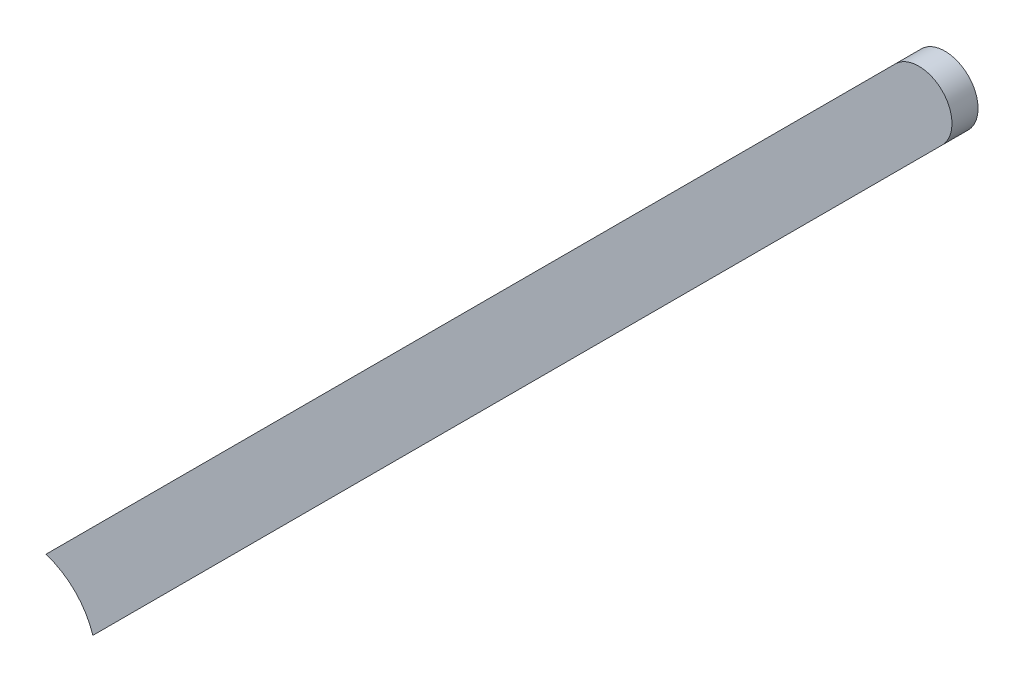
ISO-10303-21;
HEADER;
FILE_DESCRIPTION(('STEP AP214'),'2;1');
FILE_NAME('part.step','',(''),(''),'','','');
FILE_SCHEMA(('AUTOMOTIVE_DESIGN { 1 0 10303 214 1 1 1 1 }'));
ENDSEC;
DATA;
#1=APPLICATION_CONTEXT('core data for automotive mechanical design processes');
#2=APPLICATION_PROTOCOL_DEFINITION('international standard','automotive_design',2000,#1);
#3=PRODUCT_CONTEXT('',#1,'mechanical');
#4=PRODUCT('Part','Part','',(#3));
#5=PRODUCT_RELATED_PRODUCT_CATEGORY('part','',(#4));
#6=PRODUCT_DEFINITION_FORMATION('','',#4);
#7=PRODUCT_DEFINITION_CONTEXT('part definition',#1,'design');
#8=PRODUCT_DEFINITION('design','',#6,#7);
#9=PRODUCT_DEFINITION_SHAPE('','',#8);
#10=(LENGTH_UNIT() NAMED_UNIT(*) SI_UNIT(.MILLI.,.METRE.));
#11=(NAMED_UNIT(*) PLANE_ANGLE_UNIT() SI_UNIT($,.RADIAN.));
#12=(NAMED_UNIT(*) SI_UNIT($,.STERADIAN.) SOLID_ANGLE_UNIT());
#13=UNCERTAINTY_MEASURE_WITH_UNIT(LENGTH_MEASURE(1.E-05),#10,'distance_accuracy_value','');
#14=(GEOMETRIC_REPRESENTATION_CONTEXT(3) GLOBAL_UNCERTAINTY_ASSIGNED_CONTEXT((#13)) GLOBAL_UNIT_ASSIGNED_CONTEXT((#10,
#11,#12)) REPRESENTATION_CONTEXT('',''));
#15=CARTESIAN_POINT('',(0.,0.,0.));
#16=DIRECTION('',(0.,0.,1.));
#17=DIRECTION('',(1.,0.,0.));
#18=AXIS2_PLACEMENT_3D('',#15,#16,#17);
#19=CARTESIAN_POINT('',(94.3815384048469,96.1783318648469,0.));
#20=DIRECTION('',(-0.707106781186547,0.707106781186548,0.));
#21=DIRECTION('',(0.707106781186548,0.707106781186547,0.));
#22=AXIS2_PLACEMENT_3D('',#19,#20,#21);
#23=PLANE('',#22);
#24=DIRECTION('',(0.707106781186548,0.707106781186547,0.));
#25=VECTOR('',#24,1.);
#26=CARTESIAN_POINT('',(94.03260594,95.8293994,0.1999996));
#27=LINE('',#26,#25);
#28=CARTESIAN_POINT('',(94.3815384048469,96.1783318648469,0.1999996));
#29=VERTEX_POINT('',#28);
#30=CARTESIAN_POINT('',(100.8906034,102.68739686,0.1999996));
#31=VERTEX_POINT('',#30);
#32=EDGE_CURVE('E11',#29,#31,#27,.T.);
#33=ORIENTED_EDGE('',*,*,#32,.F.);
#34=DIRECTION('',(0.,0.,1.));
#35=VECTOR('',#34,1.);
#36=CARTESIAN_POINT('',(94.3815384048469,96.1783318648469,0.));
#37=LINE('',#36,#35);
#38=CARTESIAN_POINT('',(94.3815384048469,96.1783318648469,0.));
#39=VERTEX_POINT('',#38);
#40=EDGE_CURVE('E24',#39,#29,#37,.T.);
#41=ORIENTED_EDGE('',*,*,#40,.F.);
#42=DIRECTION('',(0.707106781186548,0.707106781186547,0.));
#43=VECTOR('',#42,1.);
#44=CARTESIAN_POINT('',(94.03260594,95.8293994,0.));
#45=LINE('',#44,#43);
#46=CARTESIAN_POINT('',(100.8906034,102.68739686,0.));
#47=VERTEX_POINT('',#46);
#48=EDGE_CURVE('E75',#39,#47,#45,.T.);
#49=ORIENTED_EDGE('',*,*,#48,.T.);
#50=DIRECTION('',(0.,0.,1.));
#51=VECTOR('',#50,1.);
#52=CARTESIAN_POINT('',(100.8906034,102.68739686,0.));
#53=LINE('',#52,#51);
#54=EDGE_CURVE('E37',#47,#31,#53,.T.);
#55=ORIENTED_EDGE('',*,*,#54,.T.);
#56=EDGE_LOOP('',(#33,#41,#49,#55));
#57=FACE_BOUND('',#56,.T.);
#58=ADVANCED_FACE('F17',(#57),#23,.F.);
#59=CARTESIAN_POINT('',(100.71099873,102.86700153,0.));
#60=DIRECTION('',(0.,0.,-1.));
#61=DIRECTION('',(0.707106781186576,-0.70710678118652,0.));
#62=AXIS2_PLACEMENT_3D('',#59,#60,#61);
#63=CYLINDRICAL_SURFACE('',#62,0.253999360179546);
#64=CARTESIAN_POINT('',(100.71099873,102.86700153,0.1999996));
#65=DIRECTION('',(0.,0.,1.));
#66=DIRECTION('',(0.707106781186576,-0.70710678118652,0.));
#67=AXIS2_PLACEMENT_3D('',#64,#65,#66);
#68=CIRCLE('',#67,0.253999360179546);
#69=CARTESIAN_POINT('',(100.53139406,103.0466062,0.1999996));
#70=VERTEX_POINT('',#69);
#71=EDGE_CURVE('E83',#31,#70,#68,.T.);
#72=ORIENTED_EDGE('',*,*,#71,.F.);
#73=ORIENTED_EDGE('',*,*,#54,.F.);
#74=CARTESIAN_POINT('',(100.71099873,102.86700153,0.));
#75=DIRECTION('',(0.,0.,1.));
#76=DIRECTION('',(0.707106781186576,-0.70710678118652,0.));
#77=AXIS2_PLACEMENT_3D('',#74,#75,#76);
#78=CIRCLE('',#77,0.253999360179546);
#79=CARTESIAN_POINT('',(100.53139406,103.0466062,0.));
#80=VERTEX_POINT('',#79);
#81=EDGE_CURVE('E81',#47,#80,#78,.T.);
#82=ORIENTED_EDGE('',*,*,#81,.T.);
#83=DIRECTION('',(0.,0.,1.));
#84=VECTOR('',#83,1.);
#85=CARTESIAN_POINT('',(100.53139406,103.0466062,0.));
#86=LINE('',#85,#84);
#87=EDGE_CURVE('E67',#80,#70,#86,.T.);
#88=ORIENTED_EDGE('',*,*,#87,.T.);
#89=EDGE_LOOP('',(#72,#73,#82,#88));
#90=FACE_BOUND('',#89,.T.);
#91=ADVANCED_FACE('F89',(#90),#63,.T.);
#92=CARTESIAN_POINT('',(100.53139406,103.0466062,0.));
#93=DIRECTION('',(0.707106781186548,-0.707106781186548,0.));
#94=DIRECTION('',(-0.707106781186548,-0.707106781186548,0.));
#95=AXIS2_PLACEMENT_3D('',#92,#93,#94);
#96=PLANE('',#95);
#97=DIRECTION('',(-0.707106781186548,-0.707106781186548,0.));
#98=VECTOR('',#97,1.);
#99=CARTESIAN_POINT('',(100.53139406,103.0466062,0.1999996));
#100=LINE('',#99,#98);
#101=CARTESIAN_POINT('',(94.0223290648469,96.5375412048469,0.1999996));
#102=VERTEX_POINT('',#101);
#103=EDGE_CURVE('E71',#70,#102,#100,.T.);
#104=ORIENTED_EDGE('',*,*,#103,.F.);
#105=ORIENTED_EDGE('',*,*,#87,.F.);
#106=DIRECTION('',(-0.707106781186548,-0.707106781186548,0.));
#107=VECTOR('',#106,1.);
#108=CARTESIAN_POINT('',(100.53139406,103.0466062,0.));
#109=LINE('',#108,#107);
#110=CARTESIAN_POINT('',(94.0223290648469,96.5375412048469,0.));
#111=VERTEX_POINT('',#110);
#112=EDGE_CURVE('E63',#80,#111,#109,.T.);
#113=ORIENTED_EDGE('',*,*,#112,.T.);
#114=DIRECTION('',(0.,0.,1.));
#115=VECTOR('',#114,1.);
#116=CARTESIAN_POINT('',(94.0223290648469,96.5375412048469,0.));
#117=LINE('',#116,#115);
#118=EDGE_CURVE('E53',#111,#102,#117,.T.);
#119=ORIENTED_EDGE('',*,*,#118,.T.);
#120=EDGE_LOOP('',(#104,#105,#113,#119));
#121=FACE_BOUND('',#120,.T.);
#122=ADVANCED_FACE('F66',(#121),#96,.F.);
#123=CARTESIAN_POINT('',(93.853,96.0090028,0.));
#124=DIRECTION('',(0.,0.,-1.));
#125=DIRECTION('',(1.,0.,0.));
#126=AXIS2_PLACEMENT_3D('',#123,#124,#125);
#127=CYLINDRICAL_SURFACE('',#126,0.55500016);
#128=ORIENTED_EDGE('',*,*,#40,.T.);
#129=CARTESIAN_POINT('',(93.853,96.0090028,0.1999996));
#130=DIRECTION('',(0.,0.,1.));
#131=DIRECTION('',(1.,0.,0.));
#132=AXIS2_PLACEMENT_3D('',#129,#130,#131);
#133=CIRCLE('',#132,0.55500016);
#134=EDGE_CURVE('E59',#29,#102,#133,.T.);
#135=ORIENTED_EDGE('',*,*,#134,.T.);
#136=ORIENTED_EDGE('',*,*,#118,.F.);
#137=CARTESIAN_POINT('',(93.853,96.0090028,0.));
#138=DIRECTION('',(0.,0.,1.));
#139=DIRECTION('',(1.,0.,0.));
#140=AXIS2_PLACEMENT_3D('',#137,#138,#139);
#141=CIRCLE('',#140,0.55500016);
#142=EDGE_CURVE('E57',#39,#111,#141,.T.);
#143=ORIENTED_EDGE('',*,*,#142,.F.);
#144=EDGE_LOOP('',(#128,#135,#136,#143));
#145=FACE_BOUND('',#144,.T.);
#146=ADVANCED_FACE('F55',(#145),#127,.F.);
#147=CARTESIAN_POINT('',(94.03260594,95.8293994,0.));
#148=DIRECTION('',(0.,0.,-1.));
#149=DIRECTION('',(-1.,0.,0.));
#150=AXIS2_PLACEMENT_3D('',#147,#148,#149);
#151=PLANE('',#150);
#152=ORIENTED_EDGE('',*,*,#48,.F.);
#153=ORIENTED_EDGE('',*,*,#142,.T.);
#154=ORIENTED_EDGE('',*,*,#112,.F.);
#155=ORIENTED_EDGE('',*,*,#81,.F.);
#156=EDGE_LOOP('',(#152,#153,#154,#155));
#157=FACE_BOUND('',#156,.T.);
#158=ADVANCED_FACE('F74',(#157),#151,.T.);
#159=CARTESIAN_POINT('',(94.03260594,95.8293994,0.1999996));
#160=DIRECTION('',(0.,0.,-1.));
#161=DIRECTION('',(-1.,0.,0.));
#162=AXIS2_PLACEMENT_3D('',#159,#160,#161);
#163=PLANE('',#162);
#164=ORIENTED_EDGE('',*,*,#134,.F.);
#165=ORIENTED_EDGE('',*,*,#32,.T.);
#166=ORIENTED_EDGE('',*,*,#71,.T.);
#167=ORIENTED_EDGE('',*,*,#103,.T.);
#168=EDGE_LOOP('',(#164,#165,#166,#167));
#169=FACE_BOUND('',#168,.T.);
#170=ADVANCED_FACE('F91',(#169),#163,.F.);
#171=CLOSED_SHELL('',(#58,#91,#122,#146,#158,#170));
#172=MANIFOLD_SOLID_BREP('B1',#171);
#173=ADVANCED_BREP_SHAPE_REPRESENTATION('',(#18,#172),#14);
#174=SHAPE_DEFINITION_REPRESENTATION(#9,#173);
ENDSEC;
END-ISO-10303-21;
